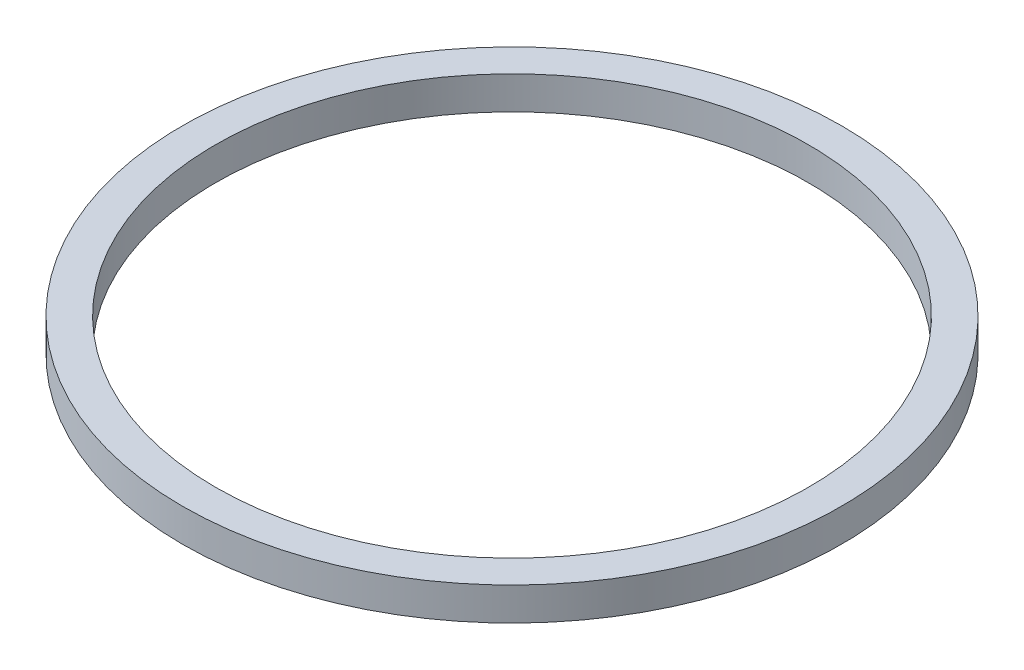
ISO-10303-21;
HEADER;
FILE_DESCRIPTION(('STEP AP214'),'2;1');
FILE_NAME('part.step','',(''),(''),'','','');
FILE_SCHEMA(('AUTOMOTIVE_DESIGN { 1 0 10303 214 1 1 1 1 }'));
ENDSEC;
DATA;
#1=APPLICATION_CONTEXT('core data for automotive mechanical design processes');
#2=APPLICATION_PROTOCOL_DEFINITION('international standard','automotive_design',2000,#1);
#3=PRODUCT_CONTEXT('',#1,'mechanical');
#4=PRODUCT('Part','Part','',(#3));
#5=PRODUCT_RELATED_PRODUCT_CATEGORY('part','',(#4));
#6=PRODUCT_DEFINITION_FORMATION('','',#4);
#7=PRODUCT_DEFINITION_CONTEXT('part definition',#1,'design');
#8=PRODUCT_DEFINITION('design','',#6,#7);
#9=PRODUCT_DEFINITION_SHAPE('','',#8);
#10=(LENGTH_UNIT() NAMED_UNIT(*) SI_UNIT(.MILLI.,.METRE.));
#11=(NAMED_UNIT(*) PLANE_ANGLE_UNIT() SI_UNIT($,.RADIAN.));
#12=(NAMED_UNIT(*) SI_UNIT($,.STERADIAN.) SOLID_ANGLE_UNIT());
#13=UNCERTAINTY_MEASURE_WITH_UNIT(LENGTH_MEASURE(1.E-05),#10,'distance_accuracy_value','');
#14=(GEOMETRIC_REPRESENTATION_CONTEXT(3) GLOBAL_UNCERTAINTY_ASSIGNED_CONTEXT((#13)) GLOBAL_UNIT_ASSIGNED_CONTEXT((#10,
#11,#12)) REPRESENTATION_CONTEXT('',''));
#15=CARTESIAN_POINT('',(0.,0.,0.));
#16=DIRECTION('',(0.,0.,1.));
#17=DIRECTION('',(1.,0.,0.));
#18=AXIS2_PLACEMENT_3D('',#15,#16,#17);
#19=CARTESIAN_POINT('',(0.,1.,0.));
#20=DIRECTION('',(0.,-1.,0.));
#21=DIRECTION('',(0.,0.,-1.));
#22=AXIS2_PLACEMENT_3D('',#19,#20,#21);
#23=CYLINDRICAL_SURFACE('',#22,10.);
#24=CARTESIAN_POINT('',(0.,1.,0.));
#25=DIRECTION('',(0.,1.,0.));
#26=DIRECTION('',(0.,0.,1.));
#27=AXIS2_PLACEMENT_3D('',#24,#25,#26);
#28=CIRCLE('',#27,10.);
#29=CARTESIAN_POINT('',(0.,1.,10.));
#30=VERTEX_POINT('',#29);
#31=EDGE_CURVE('E10',#30,#30,#28,.T.);
#32=ORIENTED_EDGE('',*,*,#31,.F.);
#33=EDGE_LOOP('',(#32));
#34=FACE_BOUND('',#33,.T.);
#35=CARTESIAN_POINT('',(0.,0.,0.));
#36=DIRECTION('',(0.,1.,0.));
#37=DIRECTION('',(0.,0.,1.));
#38=AXIS2_PLACEMENT_3D('',#35,#36,#37);
#39=CIRCLE('',#38,10.);
#40=CARTESIAN_POINT('',(0.,0.,10.));
#41=VERTEX_POINT('',#40);
#42=EDGE_CURVE('E36',#41,#41,#39,.T.);
#43=ORIENTED_EDGE('',*,*,#42,.T.);
#44=EDGE_LOOP('',(#43));
#45=FACE_BOUND('',#44,.T.);
#46=ADVANCED_FACE('F33',(#34,#45),#23,.T.);
#47=CARTESIAN_POINT('',(0.,1.,0.));
#48=DIRECTION('',(0.,1.,0.));
#49=DIRECTION('',(0.,0.,1.));
#50=AXIS2_PLACEMENT_3D('',#47,#48,#49);
#51=PLANE('',#50);
#52=CARTESIAN_POINT('',(0.,1.,0.));
#53=DIRECTION('',(0.,1.,0.));
#54=DIRECTION('',(0.,0.,1.));
#55=AXIS2_PLACEMENT_3D('',#52,#53,#54);
#56=CIRCLE('',#55,9.);
#57=CARTESIAN_POINT('',(0.,1.,9.));
#58=VERTEX_POINT('',#57);
#59=EDGE_CURVE('E45',#58,#58,#56,.T.);
#60=ORIENTED_EDGE('',*,*,#59,.F.);
#61=EDGE_LOOP('',(#60));
#62=FACE_BOUND('',#61,.T.);
#63=ORIENTED_EDGE('',*,*,#31,.T.);
#64=EDGE_LOOP('',(#63));
#65=FACE_BOUND('',#64,.T.);
#66=ADVANCED_FACE('F60',(#62,#65),#51,.T.);
#67=CARTESIAN_POINT('',(0.,0.,0.));
#68=DIRECTION('',(0.,1.,0.));
#69=DIRECTION('',(0.,0.,1.));
#70=AXIS2_PLACEMENT_3D('',#67,#68,#69);
#71=PLANE('',#70);
#72=CARTESIAN_POINT('',(0.,0.,0.));
#73=DIRECTION('',(0.,1.,0.));
#74=DIRECTION('',(0.,0.,1.));
#75=AXIS2_PLACEMENT_3D('',#72,#73,#74);
#76=CIRCLE('',#75,9.);
#77=CARTESIAN_POINT('',(0.,0.,9.));
#78=VERTEX_POINT('',#77);
#79=EDGE_CURVE('E43',#78,#78,#76,.T.);
#80=ORIENTED_EDGE('',*,*,#79,.T.);
#81=EDGE_LOOP('',(#80));
#82=FACE_BOUND('',#81,.T.);
#83=ORIENTED_EDGE('',*,*,#42,.F.);
#84=EDGE_LOOP('',(#83));
#85=FACE_BOUND('',#84,.T.);
#86=ADVANCED_FACE('F51',(#82,#85),#71,.F.);
#87=CARTESIAN_POINT('',(0.,0.,0.));
#88=DIRECTION('',(0.,1.,0.));
#89=DIRECTION('',(0.,0.,1.));
#90=AXIS2_PLACEMENT_3D('',#87,#88,#89);
#91=CYLINDRICAL_SURFACE('',#90,9.);
#92=ORIENTED_EDGE('',*,*,#79,.F.);
#93=EDGE_LOOP('',(#92));
#94=FACE_BOUND('',#93,.T.);
#95=ORIENTED_EDGE('',*,*,#59,.T.);
#96=EDGE_LOOP('',(#95));
#97=FACE_BOUND('',#96,.T.);
#98=ADVANCED_FACE('F54',(#94,#97),#91,.F.);
#99=CLOSED_SHELL('',(#46,#66,#86,#98));
#100=MANIFOLD_SOLID_BREP('B2',#99);
#101=ADVANCED_BREP_SHAPE_REPRESENTATION('',(#18,#100),#14);
#102=SHAPE_DEFINITION_REPRESENTATION(#9,#101);
ENDSEC;
END-ISO-10303-21;
